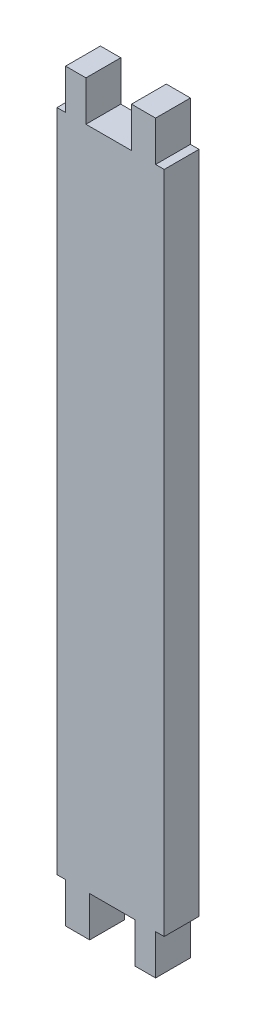
ISO-10303-21;
HEADER;
FILE_DESCRIPTION(('STEP AP214'),'2;1');
FILE_NAME('part.step','',(''),(''),'','','');
FILE_SCHEMA(('AUTOMOTIVE_DESIGN { 1 0 10303 214 1 1 1 1 }'));
ENDSEC;
DATA;
#1=APPLICATION_CONTEXT('core data for automotive mechanical design processes');
#2=APPLICATION_PROTOCOL_DEFINITION('international standard','automotive_design',2000,#1);
#3=PRODUCT_CONTEXT('',#1,'mechanical');
#4=PRODUCT('Part','Part','',(#3));
#5=PRODUCT_RELATED_PRODUCT_CATEGORY('part','',(#4));
#6=PRODUCT_DEFINITION_FORMATION('','',#4);
#7=PRODUCT_DEFINITION_CONTEXT('part definition',#1,'design');
#8=PRODUCT_DEFINITION('design','',#6,#7);
#9=PRODUCT_DEFINITION_SHAPE('','',#8);
#10=(LENGTH_UNIT() NAMED_UNIT(*) SI_UNIT(.MILLI.,.METRE.));
#11=(NAMED_UNIT(*) PLANE_ANGLE_UNIT() SI_UNIT($,.RADIAN.));
#12=(NAMED_UNIT(*) SI_UNIT($,.STERADIAN.) SOLID_ANGLE_UNIT());
#13=UNCERTAINTY_MEASURE_WITH_UNIT(LENGTH_MEASURE(1.E-05),#10,'distance_accuracy_value','');
#14=(GEOMETRIC_REPRESENTATION_CONTEXT(3) GLOBAL_UNCERTAINTY_ASSIGNED_CONTEXT((#13)) GLOBAL_UNIT_ASSIGNED_CONTEXT((#10,
#11,#12)) REPRESENTATION_CONTEXT('',''));
#15=CARTESIAN_POINT('',(0.,0.,0.));
#16=DIRECTION('',(0.,0.,1.));
#17=DIRECTION('',(1.,0.,0.));
#18=AXIS2_PLACEMENT_3D('',#15,#16,#17);
#19=CARTESIAN_POINT('',(-23.399,0.502,17.5001));
#20=DIRECTION('',(-1.,0.,0.));
#21=DIRECTION('',(0.,-1.,0.));
#22=AXIS2_PLACEMENT_3D('',#19,#20,#21);
#23=PLANE('',#22);
#24=DIRECTION('',(0.,1.,0.));
#25=VECTOR('',#24,1.);
#26=CARTESIAN_POINT('',(-23.399,-6.999,24.0001));
#27=LINE('',#26,#25);
#28=CARTESIAN_POINT('',(-23.399,-6.999,24.0001));
#29=VERTEX_POINT('',#28);
#30=CARTESIAN_POINT('',(-23.399,0.502,24.0001));
#31=VERTEX_POINT('',#30);
#32=EDGE_CURVE('E169',#29,#31,#27,.T.);
#33=ORIENTED_EDGE('',*,*,#32,.T.);
#34=DIRECTION('',(0.,0.,-1.));
#35=VECTOR('',#34,1.);
#36=CARTESIAN_POINT('',(-23.399,0.502,24.0001));
#37=LINE('',#36,#35);
#38=CARTESIAN_POINT('',(-23.399,0.502,17.5001));
#39=VERTEX_POINT('',#38);
#40=EDGE_CURVE('E158',#39,#31,#37,.F.);
#41=ORIENTED_EDGE('',*,*,#40,.F.);
#42=DIRECTION('',(0.,-1.,0.));
#43=VECTOR('',#42,1.);
#44=CARTESIAN_POINT('',(-23.399,0.502,17.5001));
#45=LINE('',#44,#43);
#46=CARTESIAN_POINT('',(-23.399,-6.999,17.5001));
#47=VERTEX_POINT('',#46);
#48=EDGE_CURVE('E168',#39,#47,#45,.T.);
#49=ORIENTED_EDGE('',*,*,#48,.T.);
#50=DIRECTION('',(0.,0.,1.));
#51=VECTOR('',#50,1.);
#52=CARTESIAN_POINT('',(-23.399,-6.999,17.5001));
#53=LINE('',#52,#51);
#54=EDGE_CURVE('E181',#47,#29,#53,.T.);
#55=ORIENTED_EDGE('',*,*,#54,.T.);
#56=EDGE_LOOP('',(#33,#41,#49,#55));
#57=FACE_BOUND('',#56,.T.);
#58=ADVANCED_FACE('F17',(#57),#23,.T.);
#59=CARTESIAN_POINT('',(-18.,-6.999,24.0001));
#60=DIRECTION('',(0.,0.,1.));
#61=DIRECTION('',(0.,1.,0.));
#62=AXIS2_PLACEMENT_3D('',#59,#60,#61);
#63=PLANE('',#62);
#64=ORIENTED_EDGE('',*,*,#32,.F.);
#65=DIRECTION('',(1.,0.,0.));
#66=VECTOR('',#65,1.);
#67=CARTESIAN_POINT('',(-23.399,-6.999,24.0001));
#68=LINE('',#67,#66);
#69=CARTESIAN_POINT('',(-19.601,-6.999,24.0001));
#70=VERTEX_POINT('',#69);
#71=EDGE_CURVE('E192',#70,#29,#68,.F.);
#72=ORIENTED_EDGE('',*,*,#71,.F.);
#73=DIRECTION('',(0.,1.,0.));
#74=VECTOR('',#73,1.);
#75=CARTESIAN_POINT('',(-19.601,-6.999,24.0001));
#76=LINE('',#75,#74);
#77=CARTESIAN_POINT('',(-19.601,0.502,24.0001));
#78=VERTEX_POINT('',#77);
#79=EDGE_CURVE('E196',#78,#70,#76,.F.);
#80=ORIENTED_EDGE('',*,*,#79,.F.);
#81=DIRECTION('',(1.,0.,0.));
#82=VECTOR('',#81,1.);
#83=CARTESIAN_POINT('',(-19.601,0.502,24.0001));
#84=LINE('',#83,#82);
#85=CARTESIAN_POINT('',(-18.,0.502,24.0001));
#86=VERTEX_POINT('',#85);
#87=EDGE_CURVE('E200',#86,#78,#84,.F.);
#88=ORIENTED_EDGE('',*,*,#87,.F.);
#89=DIRECTION('',(0.,1.,0.));
#90=VECTOR('',#89,1.);
#91=CARTESIAN_POINT('',(-18.,0.502,24.0001));
#92=LINE('',#91,#90);
#93=CARTESIAN_POINT('',(-18.,124.5,24.0001));
#94=VERTEX_POINT('',#93);
#95=EDGE_CURVE('E204',#94,#86,#92,.F.);
#96=ORIENTED_EDGE('',*,*,#95,.F.);
#97=DIRECTION('',(-1.,0.,0.));
#98=VECTOR('',#97,1.);
#99=CARTESIAN_POINT('',(-18.,124.5,24.0001));
#100=LINE('',#99,#98);
#101=CARTESIAN_POINT('',(-19.601,124.5,24.0001));
#102=VERTEX_POINT('',#101);
#103=EDGE_CURVE('E208',#102,#94,#100,.F.);
#104=ORIENTED_EDGE('',*,*,#103,.F.);
#105=DIRECTION('',(0.,1.,0.));
#106=VECTOR('',#105,1.);
#107=CARTESIAN_POINT('',(-19.601,124.5,24.0001));
#108=LINE('',#107,#106);
#109=CARTESIAN_POINT('',(-19.601,132.001,24.0001));
#110=VERTEX_POINT('',#109);
#111=EDGE_CURVE('E212',#110,#102,#108,.F.);
#112=ORIENTED_EDGE('',*,*,#111,.F.);
#113=DIRECTION('',(-1.,0.,0.));
#114=VECTOR('',#113,1.);
#115=CARTESIAN_POINT('',(-19.601,132.001,24.0001));
#116=LINE('',#115,#114);
#117=CARTESIAN_POINT('',(-24.099,132.001,24.0001));
#118=VERTEX_POINT('',#117);
#119=EDGE_CURVE('E216',#118,#110,#116,.F.);
#120=ORIENTED_EDGE('',*,*,#119,.F.);
#121=DIRECTION('',(0.,-1.,0.));
#122=VECTOR('',#121,1.);
#123=CARTESIAN_POINT('',(-24.099,132.001,24.0001));
#124=LINE('',#123,#122);
#125=CARTESIAN_POINT('',(-24.099,124.5,24.0001));
#126=VERTEX_POINT('',#125);
#127=EDGE_CURVE('E220',#126,#118,#124,.F.);
#128=ORIENTED_EDGE('',*,*,#127,.F.);
#129=DIRECTION('',(-1.,0.,0.));
#130=VECTOR('',#129,1.);
#131=CARTESIAN_POINT('',(-24.099,124.5,24.0001));
#132=LINE('',#131,#130);
#133=CARTESIAN_POINT('',(-32.601,124.5,24.0001));
#134=VERTEX_POINT('',#133);
#135=EDGE_CURVE('E224',#134,#126,#132,.F.);
#136=ORIENTED_EDGE('',*,*,#135,.F.);
#137=DIRECTION('',(0.,1.,0.));
#138=VECTOR('',#137,1.);
#139=CARTESIAN_POINT('',(-32.601,124.5,24.0001));
#140=LINE('',#139,#138);
#141=CARTESIAN_POINT('',(-32.601,132.001,24.0001));
#142=VERTEX_POINT('',#141);
#143=EDGE_CURVE('E228',#142,#134,#140,.F.);
#144=ORIENTED_EDGE('',*,*,#143,.F.);
#145=DIRECTION('',(-1.,0.,0.));
#146=VECTOR('',#145,1.);
#147=CARTESIAN_POINT('',(-32.601,132.001,24.0001));
#148=LINE('',#147,#146);
#149=CARTESIAN_POINT('',(-36.399,132.001,24.0001));
#150=VERTEX_POINT('',#149);
#151=EDGE_CURVE('E232',#150,#142,#148,.F.);
#152=ORIENTED_EDGE('',*,*,#151,.F.);
#153=DIRECTION('',(0.,-1.,0.));
#154=VECTOR('',#153,1.);
#155=CARTESIAN_POINT('',(-36.399,132.001,24.0001));
#156=LINE('',#155,#154);
#157=CARTESIAN_POINT('',(-36.399,124.5,24.0001));
#158=VERTEX_POINT('',#157);
#159=EDGE_CURVE('E236',#158,#150,#156,.F.);
#160=ORIENTED_EDGE('',*,*,#159,.F.);
#161=DIRECTION('',(-1.,0.,0.));
#162=VECTOR('',#161,1.);
#163=CARTESIAN_POINT('',(-36.399,124.5,24.0001));
#164=LINE('',#163,#162);
#165=CARTESIAN_POINT('',(-38.,124.5,24.0001));
#166=VERTEX_POINT('',#165);
#167=EDGE_CURVE('E240',#166,#158,#164,.F.);
#168=ORIENTED_EDGE('',*,*,#167,.F.);
#169=DIRECTION('',(0.,-1.,0.));
#170=VECTOR('',#169,1.);
#171=CARTESIAN_POINT('',(-38.,124.5,24.0001));
#172=LINE('',#171,#170);
#173=CARTESIAN_POINT('',(-38.,0.502,24.0001));
#174=VERTEX_POINT('',#173);
#175=EDGE_CURVE('E244',#174,#166,#172,.F.);
#176=ORIENTED_EDGE('',*,*,#175,.F.);
#177=DIRECTION('',(1.,0.,0.));
#178=VECTOR('',#177,1.);
#179=CARTESIAN_POINT('',(-38.,0.502,24.0001));
#180=LINE('',#179,#178);
#181=CARTESIAN_POINT('',(-36.399,0.502,24.0001));
#182=VERTEX_POINT('',#181);
#183=EDGE_CURVE('E248',#182,#174,#180,.F.);
#184=ORIENTED_EDGE('',*,*,#183,.F.);
#185=DIRECTION('',(0.,-1.,0.));
#186=VECTOR('',#185,1.);
#187=CARTESIAN_POINT('',(-36.399,0.502,24.0001));
#188=LINE('',#187,#186);
#189=CARTESIAN_POINT('',(-36.399,-6.999,24.0001));
#190=VERTEX_POINT('',#189);
#191=EDGE_CURVE('E252',#190,#182,#188,.F.);
#192=ORIENTED_EDGE('',*,*,#191,.F.);
#193=DIRECTION('',(1.,0.,0.));
#194=VECTOR('',#193,1.);
#195=CARTESIAN_POINT('',(-36.399,-6.999,24.0001));
#196=LINE('',#195,#194);
#197=CARTESIAN_POINT('',(-31.901,-6.999,24.0001));
#198=VERTEX_POINT('',#197);
#199=EDGE_CURVE('E256',#198,#190,#196,.F.);
#200=ORIENTED_EDGE('',*,*,#199,.F.);
#201=DIRECTION('',(0.,1.,0.));
#202=VECTOR('',#201,1.);
#203=CARTESIAN_POINT('',(-31.901,-6.999,24.0001));
#204=LINE('',#203,#202);
#205=CARTESIAN_POINT('',(-31.901,0.502,24.0001));
#206=VERTEX_POINT('',#205);
#207=EDGE_CURVE('E177',#206,#198,#204,.F.);
#208=ORIENTED_EDGE('',*,*,#207,.F.);
#209=DIRECTION('',(1.,0.,0.));
#210=VECTOR('',#209,1.);
#211=CARTESIAN_POINT('',(-31.901,0.502,24.0001));
#212=LINE('',#211,#210);
#213=EDGE_CURVE('E162',#31,#206,#212,.F.);
#214=ORIENTED_EDGE('',*,*,#213,.F.);
#215=EDGE_LOOP('',(#64,#72,#80,#88,#96,#104,#112,#120,#128,#136,#144,#152,#160,#168,#176,#184,
#192,#200,#208,#214));
#216=FACE_BOUND('',#215,.T.);
#217=ADVANCED_FACE('F174',(#216),#63,.T.);
#218=CARTESIAN_POINT('',(-31.901,0.502,17.5001));
#219=DIRECTION('',(0.,-1.,0.));
#220=DIRECTION('',(1.,0.,0.));
#221=AXIS2_PLACEMENT_3D('',#218,#219,#220);
#222=PLANE('',#221);
#223=ORIENTED_EDGE('',*,*,#213,.T.);
#224=DIRECTION('',(0.,0.,-1.));
#225=VECTOR('',#224,1.);
#226=CARTESIAN_POINT('',(-31.901,0.502,24.0001));
#227=LINE('',#226,#225);
#228=CARTESIAN_POINT('',(-31.901,0.502,17.5001));
#229=VERTEX_POINT('',#228);
#230=EDGE_CURVE('E178',#229,#206,#227,.F.);
#231=ORIENTED_EDGE('',*,*,#230,.F.);
#232=DIRECTION('',(1.,0.,0.));
#233=VECTOR('',#232,1.);
#234=CARTESIAN_POINT('',(-31.901,0.502,17.5001));
#235=LINE('',#234,#233);
#236=EDGE_CURVE('E164',#229,#39,#235,.T.);
#237=ORIENTED_EDGE('',*,*,#236,.T.);
#238=ORIENTED_EDGE('',*,*,#40,.T.);
#239=EDGE_LOOP('',(#223,#231,#237,#238));
#240=FACE_BOUND('',#239,.T.);
#241=ADVANCED_FACE('F160',(#240),#222,.T.);
#242=CARTESIAN_POINT('',(-18.,-6.999,17.5001));
#243=DIRECTION('',(0.,0.,-1.));
#244=DIRECTION('',(-1.,0.,0.));
#245=AXIS2_PLACEMENT_3D('',#242,#243,#244);
#246=PLANE('',#245);
#247=DIRECTION('',(-1.,0.,0.));
#248=VECTOR('',#247,1.);
#249=CARTESIAN_POINT('',(-19.601,-6.999,17.5001));
#250=LINE('',#249,#248);
#251=CARTESIAN_POINT('',(-19.601,-6.999,17.5001));
#252=VERTEX_POINT('',#251);
#253=EDGE_CURVE('E271',#47,#252,#250,.F.);
#254=ORIENTED_EDGE('',*,*,#253,.F.);
#255=ORIENTED_EDGE('',*,*,#48,.F.);
#256=ORIENTED_EDGE('',*,*,#236,.F.);
#257=DIRECTION('',(0.,-1.,0.));
#258=VECTOR('',#257,1.);
#259=CARTESIAN_POINT('',(-31.901,0.502,17.5001));
#260=LINE('',#259,#258);
#261=CARTESIAN_POINT('',(-31.901,-6.999,17.5001));
#262=VERTEX_POINT('',#261);
#263=EDGE_CURVE('E276',#262,#229,#260,.F.);
#264=ORIENTED_EDGE('',*,*,#263,.F.);
#265=DIRECTION('',(-1.,0.,0.));
#266=VECTOR('',#265,1.);
#267=CARTESIAN_POINT('',(-31.901,-6.999,17.5001));
#268=LINE('',#267,#266);
#269=CARTESIAN_POINT('',(-36.399,-6.999,17.5001));
#270=VERTEX_POINT('',#269);
#271=EDGE_CURVE('E280',#270,#262,#268,.F.);
#272=ORIENTED_EDGE('',*,*,#271,.F.);
#273=DIRECTION('',(0.,1.,0.));
#274=VECTOR('',#273,1.);
#275=CARTESIAN_POINT('',(-36.399,-6.999,17.5001));
#276=LINE('',#275,#274);
#277=CARTESIAN_POINT('',(-36.399,0.502,17.5001));
#278=VERTEX_POINT('',#277);
#279=EDGE_CURVE('E285',#278,#270,#276,.F.);
#280=ORIENTED_EDGE('',*,*,#279,.F.);
#281=DIRECTION('',(-1.,0.,0.));
#282=VECTOR('',#281,1.);
#283=CARTESIAN_POINT('',(-36.399,0.502,17.5001));
#284=LINE('',#283,#282);
#285=CARTESIAN_POINT('',(-38.,0.502,17.5001));
#286=VERTEX_POINT('',#285);
#287=EDGE_CURVE('E290',#286,#278,#284,.F.);
#288=ORIENTED_EDGE('',*,*,#287,.F.);
#289=DIRECTION('',(0.,1.,0.));
#290=VECTOR('',#289,1.);
#291=CARTESIAN_POINT('',(-38.,0.502,17.5001));
#292=LINE('',#291,#290);
#293=CARTESIAN_POINT('',(-38.,124.5,17.5001));
#294=VERTEX_POINT('',#293);
#295=EDGE_CURVE('E295',#294,#286,#292,.F.);
#296=ORIENTED_EDGE('',*,*,#295,.F.);
#297=DIRECTION('',(1.,0.,0.));
#298=VECTOR('',#297,1.);
#299=CARTESIAN_POINT('',(-38.,124.5,17.5001));
#300=LINE('',#299,#298);
#301=CARTESIAN_POINT('',(-36.399,124.5,17.5001));
#302=VERTEX_POINT('',#301);
#303=EDGE_CURVE('E300',#302,#294,#300,.F.);
#304=ORIENTED_EDGE('',*,*,#303,.F.);
#305=DIRECTION('',(0.,1.,0.));
#306=VECTOR('',#305,1.);
#307=CARTESIAN_POINT('',(-36.399,124.5,17.5001));
#308=LINE('',#307,#306);
#309=CARTESIAN_POINT('',(-36.399,132.001,17.5001));
#310=VERTEX_POINT('',#309);
#311=EDGE_CURVE('E305',#310,#302,#308,.F.);
#312=ORIENTED_EDGE('',*,*,#311,.F.);
#313=DIRECTION('',(1.,0.,0.));
#314=VECTOR('',#313,1.);
#315=CARTESIAN_POINT('',(-36.399,132.001,17.5001));
#316=LINE('',#315,#314);
#317=CARTESIAN_POINT('',(-32.601,132.001,17.5001));
#318=VERTEX_POINT('',#317);
#319=EDGE_CURVE('E310',#318,#310,#316,.F.);
#320=ORIENTED_EDGE('',*,*,#319,.F.);
#321=DIRECTION('',(0.,-1.,0.));
#322=VECTOR('',#321,1.);
#323=CARTESIAN_POINT('',(-32.601,132.001,17.5001));
#324=LINE('',#323,#322);
#325=CARTESIAN_POINT('',(-32.601,124.5,17.5001));
#326=VERTEX_POINT('',#325);
#327=EDGE_CURVE('E315',#326,#318,#324,.F.);
#328=ORIENTED_EDGE('',*,*,#327,.F.);
#329=DIRECTION('',(1.,0.,0.));
#330=VECTOR('',#329,1.);
#331=CARTESIAN_POINT('',(-32.601,124.5,17.5001));
#332=LINE('',#331,#330);
#333=CARTESIAN_POINT('',(-24.099,124.5,17.5001));
#334=VERTEX_POINT('',#333);
#335=EDGE_CURVE('E320',#334,#326,#332,.F.);
#336=ORIENTED_EDGE('',*,*,#335,.F.);
#337=DIRECTION('',(0.,1.,0.));
#338=VECTOR('',#337,1.);
#339=CARTESIAN_POINT('',(-24.099,124.5,17.5001));
#340=LINE('',#339,#338);
#341=CARTESIAN_POINT('',(-24.099,132.001,17.5001));
#342=VERTEX_POINT('',#341);
#343=EDGE_CURVE('E325',#342,#334,#340,.F.);
#344=ORIENTED_EDGE('',*,*,#343,.F.);
#345=DIRECTION('',(1.,0.,0.));
#346=VECTOR('',#345,1.);
#347=CARTESIAN_POINT('',(-24.099,132.001,17.5001));
#348=LINE('',#347,#346);
#349=CARTESIAN_POINT('',(-19.601,132.001,17.5001));
#350=VERTEX_POINT('',#349);
#351=EDGE_CURVE('E330',#350,#342,#348,.F.);
#352=ORIENTED_EDGE('',*,*,#351,.F.);
#353=DIRECTION('',(0.,-1.,0.));
#354=VECTOR('',#353,1.);
#355=CARTESIAN_POINT('',(-19.601,132.001,17.5001));
#356=LINE('',#355,#354);
#357=CARTESIAN_POINT('',(-19.601,124.5,17.5001));
#358=VERTEX_POINT('',#357);
#359=EDGE_CURVE('E335',#358,#350,#356,.F.);
#360=ORIENTED_EDGE('',*,*,#359,.F.);
#361=DIRECTION('',(1.,0.,0.));
#362=VECTOR('',#361,1.);
#363=CARTESIAN_POINT('',(-19.601,124.5,17.5001));
#364=LINE('',#363,#362);
#365=CARTESIAN_POINT('',(-18.,124.5,17.5001));
#366=VERTEX_POINT('',#365);
#367=EDGE_CURVE('E340',#366,#358,#364,.F.);
#368=ORIENTED_EDGE('',*,*,#367,.F.);
#369=DIRECTION('',(0.,-1.,0.));
#370=VECTOR('',#369,1.);
#371=CARTESIAN_POINT('',(-18.,124.5,17.5001));
#372=LINE('',#371,#370);
#373=CARTESIAN_POINT('',(-18.,0.502,17.5001));
#374=VERTEX_POINT('',#373);
#375=EDGE_CURVE('E345',#374,#366,#372,.F.);
#376=ORIENTED_EDGE('',*,*,#375,.F.);
#377=DIRECTION('',(-1.,0.,0.));
#378=VECTOR('',#377,1.);
#379=CARTESIAN_POINT('',(-18.,0.502,17.5001));
#380=LINE('',#379,#378);
#381=CARTESIAN_POINT('',(-19.601,0.502,17.5001));
#382=VERTEX_POINT('',#381);
#383=EDGE_CURVE('E350',#382,#374,#380,.F.);
#384=ORIENTED_EDGE('',*,*,#383,.F.);
#385=DIRECTION('',(0.,-1.,0.));
#386=VECTOR('',#385,1.);
#387=CARTESIAN_POINT('',(-19.601,0.502,17.5001));
#388=LINE('',#387,#386);
#389=EDGE_CURVE('E354',#252,#382,#388,.F.);
#390=ORIENTED_EDGE('',*,*,#389,.F.);
#391=EDGE_LOOP('',(#254,#255,#256,#264,#272,#280,#288,#296,#304,#312,#320,#328,#336,#344,#352,
#360,#368,#376,#384,#390));
#392=FACE_BOUND('',#391,.T.);
#393=ADVANCED_FACE('F452',(#392),#246,.T.);
#394=CARTESIAN_POINT('',(-23.399,-6.999,17.5001));
#395=DIRECTION('',(0.,-1.,0.));
#396=DIRECTION('',(1.,0.,0.));
#397=AXIS2_PLACEMENT_3D('',#394,#395,#396);
#398=PLANE('',#397);
#399=ORIENTED_EDGE('',*,*,#71,.T.);
#400=ORIENTED_EDGE('',*,*,#54,.F.);
#401=ORIENTED_EDGE('',*,*,#253,.T.);
#402=DIRECTION('',(0.,0.,1.));
#403=VECTOR('',#402,1.);
#404=CARTESIAN_POINT('',(-19.601,-6.999,17.5001));
#405=LINE('',#404,#403);
#406=EDGE_CURVE('E33',#252,#70,#405,.T.);
#407=ORIENTED_EDGE('',*,*,#406,.T.);
#408=EDGE_LOOP('',(#399,#400,#401,#407));
#409=FACE_BOUND('',#408,.T.);
#410=ADVANCED_FACE('F496',(#409),#398,.T.);
#411=CARTESIAN_POINT('',(-19.601,-6.999,17.5001));
#412=DIRECTION('',(1.,0.,0.));
#413=DIRECTION('',(0.,1.,0.));
#414=AXIS2_PLACEMENT_3D('',#411,#412,#413);
#415=PLANE('',#414);
#416=ORIENTED_EDGE('',*,*,#79,.T.);
#417=ORIENTED_EDGE('',*,*,#406,.F.);
#418=ORIENTED_EDGE('',*,*,#389,.T.);
#419=DIRECTION('',(0.,0.,1.));
#420=VECTOR('',#419,1.);
#421=CARTESIAN_POINT('',(-19.601,0.502,17.5001));
#422=LINE('',#421,#420);
#423=EDGE_CURVE('E41',#382,#78,#422,.T.);
#424=ORIENTED_EDGE('',*,*,#423,.T.);
#425=EDGE_LOOP('',(#416,#417,#418,#424));
#426=FACE_BOUND('',#425,.T.);
#427=ADVANCED_FACE('F494',(#426),#415,.T.);
#428=CARTESIAN_POINT('',(-19.601,0.502,17.5001));
#429=DIRECTION('',(0.,-1.,0.));
#430=DIRECTION('',(1.,0.,0.));
#431=AXIS2_PLACEMENT_3D('',#428,#429,#430);
#432=PLANE('',#431);
#433=ORIENTED_EDGE('',*,*,#87,.T.);
#434=ORIENTED_EDGE('',*,*,#423,.F.);
#435=ORIENTED_EDGE('',*,*,#383,.T.);
#436=DIRECTION('',(0.,0.,1.));
#437=VECTOR('',#436,1.);
#438=CARTESIAN_POINT('',(-18.,0.502,17.5001));
#439=LINE('',#438,#437);
#440=EDGE_CURVE('E364',#374,#86,#439,.T.);
#441=ORIENTED_EDGE('',*,*,#440,.T.);
#442=EDGE_LOOP('',(#433,#434,#435,#441));
#443=FACE_BOUND('',#442,.T.);
#444=ADVANCED_FACE('F493',(#443),#432,.T.);
#445=CARTESIAN_POINT('',(-18.,0.502,17.5001));
#446=DIRECTION('',(1.,0.,0.));
#447=DIRECTION('',(0.,1.,0.));
#448=AXIS2_PLACEMENT_3D('',#445,#446,#447);
#449=PLANE('',#448);
#450=ORIENTED_EDGE('',*,*,#95,.T.);
#451=ORIENTED_EDGE('',*,*,#440,.F.);
#452=ORIENTED_EDGE('',*,*,#375,.T.);
#453=DIRECTION('',(0.,0.,1.));
#454=VECTOR('',#453,1.);
#455=CARTESIAN_POINT('',(-18.,124.5,17.5001));
#456=LINE('',#455,#454);
#457=EDGE_CURVE('E369',#366,#94,#456,.T.);
#458=ORIENTED_EDGE('',*,*,#457,.T.);
#459=EDGE_LOOP('',(#450,#451,#452,#458));
#460=FACE_BOUND('',#459,.T.);
#461=ADVANCED_FACE('F490',(#460),#449,.T.);
#462=CARTESIAN_POINT('',(-18.,124.5,17.5001));
#463=DIRECTION('',(0.,1.,0.));
#464=DIRECTION('',(-1.,0.,0.));
#465=AXIS2_PLACEMENT_3D('',#462,#463,#464);
#466=PLANE('',#465);
#467=ORIENTED_EDGE('',*,*,#103,.T.);
#468=ORIENTED_EDGE('',*,*,#457,.F.);
#469=ORIENTED_EDGE('',*,*,#367,.T.);
#470=DIRECTION('',(0.,0.,1.));
#471=VECTOR('',#470,1.);
#472=CARTESIAN_POINT('',(-19.601,124.5,17.5001));
#473=LINE('',#472,#471);
#474=EDGE_CURVE('E374',#358,#102,#473,.T.);
#475=ORIENTED_EDGE('',*,*,#474,.T.);
#476=EDGE_LOOP('',(#467,#468,#469,#475));
#477=FACE_BOUND('',#476,.T.);
#478=ADVANCED_FACE('F487',(#477),#466,.T.);
#479=CARTESIAN_POINT('',(-19.601,124.5,17.5001));
#480=DIRECTION('',(1.,0.,0.));
#481=DIRECTION('',(0.,1.,0.));
#482=AXIS2_PLACEMENT_3D('',#479,#480,#481);
#483=PLANE('',#482);
#484=ORIENTED_EDGE('',*,*,#111,.T.);
#485=ORIENTED_EDGE('',*,*,#474,.F.);
#486=ORIENTED_EDGE('',*,*,#359,.T.);
#487=DIRECTION('',(0.,0.,1.));
#488=VECTOR('',#487,1.);
#489=CARTESIAN_POINT('',(-19.601,132.001,17.5001));
#490=LINE('',#489,#488);
#491=EDGE_CURVE('E379',#350,#110,#490,.T.);
#492=ORIENTED_EDGE('',*,*,#491,.T.);
#493=EDGE_LOOP('',(#484,#485,#486,#492));
#494=FACE_BOUND('',#493,.T.);
#495=ADVANCED_FACE('F482',(#494),#483,.T.);
#496=CARTESIAN_POINT('',(-19.601,132.001,17.5001));
#497=DIRECTION('',(0.,1.,0.));
#498=DIRECTION('',(-1.,0.,0.));
#499=AXIS2_PLACEMENT_3D('',#496,#497,#498);
#500=PLANE('',#499);
#501=ORIENTED_EDGE('',*,*,#119,.T.);
#502=ORIENTED_EDGE('',*,*,#491,.F.);
#503=ORIENTED_EDGE('',*,*,#351,.T.);
#504=DIRECTION('',(0.,0.,1.));
#505=VECTOR('',#504,1.);
#506=CARTESIAN_POINT('',(-24.099,132.001,17.5001));
#507=LINE('',#506,#505);
#508=EDGE_CURVE('E384',#342,#118,#507,.T.);
#509=ORIENTED_EDGE('',*,*,#508,.T.);
#510=EDGE_LOOP('',(#501,#502,#503,#509));
#511=FACE_BOUND('',#510,.T.);
#512=ADVANCED_FACE('F479',(#511),#500,.T.);
#513=CARTESIAN_POINT('',(-24.099,132.001,17.5001));
#514=DIRECTION('',(-1.,0.,0.));
#515=DIRECTION('',(0.,-1.,0.));
#516=AXIS2_PLACEMENT_3D('',#513,#514,#515);
#517=PLANE('',#516);
#518=ORIENTED_EDGE('',*,*,#127,.T.);
#519=ORIENTED_EDGE('',*,*,#508,.F.);
#520=ORIENTED_EDGE('',*,*,#343,.T.);
#521=DIRECTION('',(0.,0.,1.));
#522=VECTOR('',#521,1.);
#523=CARTESIAN_POINT('',(-24.099,124.5,17.5001));
#524=LINE('',#523,#522);
#525=EDGE_CURVE('E389',#334,#126,#524,.T.);
#526=ORIENTED_EDGE('',*,*,#525,.T.);
#527=EDGE_LOOP('',(#518,#519,#520,#526));
#528=FACE_BOUND('',#527,.T.);
#529=ADVANCED_FACE('F474',(#528),#517,.T.);
#530=CARTESIAN_POINT('',(-24.099,124.5,17.5001));
#531=DIRECTION('',(0.,1.,0.));
#532=DIRECTION('',(-1.,0.,0.));
#533=AXIS2_PLACEMENT_3D('',#530,#531,#532);
#534=PLANE('',#533);
#535=ORIENTED_EDGE('',*,*,#135,.T.);
#536=ORIENTED_EDGE('',*,*,#525,.F.);
#537=ORIENTED_EDGE('',*,*,#335,.T.);
#538=DIRECTION('',(0.,0.,1.));
#539=VECTOR('',#538,1.);
#540=CARTESIAN_POINT('',(-32.601,124.5,17.5001));
#541=LINE('',#540,#539);
#542=EDGE_CURVE('E394',#326,#134,#541,.T.);
#543=ORIENTED_EDGE('',*,*,#542,.T.);
#544=EDGE_LOOP('',(#535,#536,#537,#543));
#545=FACE_BOUND('',#544,.T.);
#546=ADVANCED_FACE('F471',(#545),#534,.T.);
#547=CARTESIAN_POINT('',(-32.601,124.5,17.5001));
#548=DIRECTION('',(1.,0.,0.));
#549=DIRECTION('',(0.,1.,0.));
#550=AXIS2_PLACEMENT_3D('',#547,#548,#549);
#551=PLANE('',#550);
#552=ORIENTED_EDGE('',*,*,#143,.T.);
#553=ORIENTED_EDGE('',*,*,#542,.F.);
#554=ORIENTED_EDGE('',*,*,#327,.T.);
#555=DIRECTION('',(0.,0.,1.));
#556=VECTOR('',#555,1.);
#557=CARTESIAN_POINT('',(-32.601,132.001,17.5001));
#558=LINE('',#557,#556);
#559=EDGE_CURVE('E399',#318,#142,#558,.T.);
#560=ORIENTED_EDGE('',*,*,#559,.T.);
#561=EDGE_LOOP('',(#552,#553,#554,#560));
#562=FACE_BOUND('',#561,.T.);
#563=ADVANCED_FACE('F466',(#562),#551,.T.);
#564=CARTESIAN_POINT('',(-32.601,132.001,17.5001));
#565=DIRECTION('',(0.,1.,0.));
#566=DIRECTION('',(-1.,0.,0.));
#567=AXIS2_PLACEMENT_3D('',#564,#565,#566);
#568=PLANE('',#567);
#569=ORIENTED_EDGE('',*,*,#151,.T.);
#570=ORIENTED_EDGE('',*,*,#559,.F.);
#571=ORIENTED_EDGE('',*,*,#319,.T.);
#572=DIRECTION('',(0.,0.,1.));
#573=VECTOR('',#572,1.);
#574=CARTESIAN_POINT('',(-36.399,132.001,17.5001));
#575=LINE('',#574,#573);
#576=EDGE_CURVE('E404',#310,#150,#575,.T.);
#577=ORIENTED_EDGE('',*,*,#576,.T.);
#578=EDGE_LOOP('',(#569,#570,#571,#577));
#579=FACE_BOUND('',#578,.T.);
#580=ADVANCED_FACE('F463',(#579),#568,.T.);
#581=CARTESIAN_POINT('',(-36.399,132.001,17.5001));
#582=DIRECTION('',(-1.,0.,0.));
#583=DIRECTION('',(0.,-1.,0.));
#584=AXIS2_PLACEMENT_3D('',#581,#582,#583);
#585=PLANE('',#584);
#586=ORIENTED_EDGE('',*,*,#159,.T.);
#587=ORIENTED_EDGE('',*,*,#576,.F.);
#588=ORIENTED_EDGE('',*,*,#311,.T.);
#589=DIRECTION('',(0.,0.,1.));
#590=VECTOR('',#589,1.);
#591=CARTESIAN_POINT('',(-36.399,124.5,17.5001));
#592=LINE('',#591,#590);
#593=EDGE_CURVE('E409',#302,#158,#592,.T.);
#594=ORIENTED_EDGE('',*,*,#593,.T.);
#595=EDGE_LOOP('',(#586,#587,#588,#594));
#596=FACE_BOUND('',#595,.T.);
#597=ADVANCED_FACE('F458',(#596),#585,.T.);
#598=CARTESIAN_POINT('',(-36.399,124.5,17.5001));
#599=DIRECTION('',(0.,1.,0.));
#600=DIRECTION('',(-1.,0.,0.));
#601=AXIS2_PLACEMENT_3D('',#598,#599,#600);
#602=PLANE('',#601);
#603=ORIENTED_EDGE('',*,*,#167,.T.);
#604=ORIENTED_EDGE('',*,*,#593,.F.);
#605=ORIENTED_EDGE('',*,*,#303,.T.);
#606=DIRECTION('',(0.,0.,1.));
#607=VECTOR('',#606,1.);
#608=CARTESIAN_POINT('',(-38.,124.5,17.5001));
#609=LINE('',#608,#607);
#610=EDGE_CURVE('E414',#294,#166,#609,.T.);
#611=ORIENTED_EDGE('',*,*,#610,.T.);
#612=EDGE_LOOP('',(#603,#604,#605,#611));
#613=FACE_BOUND('',#612,.T.);
#614=ADVANCED_FACE('F455',(#613),#602,.T.);
#615=CARTESIAN_POINT('',(-38.,124.5,17.5001));
#616=DIRECTION('',(-1.,0.,0.));
#617=DIRECTION('',(0.,-1.,0.));
#618=AXIS2_PLACEMENT_3D('',#615,#616,#617);
#619=PLANE('',#618);
#620=ORIENTED_EDGE('',*,*,#175,.T.);
#621=ORIENTED_EDGE('',*,*,#610,.F.);
#622=ORIENTED_EDGE('',*,*,#295,.T.);
#623=DIRECTION('',(0.,0.,1.));
#624=VECTOR('',#623,1.);
#625=CARTESIAN_POINT('',(-38.,0.502,17.5001));
#626=LINE('',#625,#624);
#627=EDGE_CURVE('E419',#286,#174,#626,.T.);
#628=ORIENTED_EDGE('',*,*,#627,.T.);
#629=EDGE_LOOP('',(#620,#621,#622,#628));
#630=FACE_BOUND('',#629,.T.);
#631=ADVANCED_FACE('F447',(#630),#619,.T.);
#632=CARTESIAN_POINT('',(-38.,0.502,17.5001));
#633=DIRECTION('',(0.,-1.,0.));
#634=DIRECTION('',(1.,0.,0.));
#635=AXIS2_PLACEMENT_3D('',#632,#633,#634);
#636=PLANE('',#635);
#637=ORIENTED_EDGE('',*,*,#183,.T.);
#638=ORIENTED_EDGE('',*,*,#627,.F.);
#639=ORIENTED_EDGE('',*,*,#287,.T.);
#640=DIRECTION('',(0.,0.,1.));
#641=VECTOR('',#640,1.);
#642=CARTESIAN_POINT('',(-36.399,0.502,17.5001));
#643=LINE('',#642,#641);
#644=EDGE_CURVE('E424',#278,#182,#643,.T.);
#645=ORIENTED_EDGE('',*,*,#644,.T.);
#646=EDGE_LOOP('',(#637,#638,#639,#645));
#647=FACE_BOUND('',#646,.T.);
#648=ADVANCED_FACE('F444',(#647),#636,.T.);
#649=CARTESIAN_POINT('',(-36.399,0.502,17.5001));
#650=DIRECTION('',(-1.,0.,0.));
#651=DIRECTION('',(0.,-1.,0.));
#652=AXIS2_PLACEMENT_3D('',#649,#650,#651);
#653=PLANE('',#652);
#654=ORIENTED_EDGE('',*,*,#191,.T.);
#655=ORIENTED_EDGE('',*,*,#644,.F.);
#656=ORIENTED_EDGE('',*,*,#279,.T.);
#657=DIRECTION('',(0.,0.,1.));
#658=VECTOR('',#657,1.);
#659=CARTESIAN_POINT('',(-36.399,-6.999,17.5001));
#660=LINE('',#659,#658);
#661=EDGE_CURVE('E26',#270,#190,#660,.T.);
#662=ORIENTED_EDGE('',*,*,#661,.T.);
#663=EDGE_LOOP('',(#654,#655,#656,#662));
#664=FACE_BOUND('',#663,.T.);
#665=ADVANCED_FACE('F436',(#664),#653,.T.);
#666=CARTESIAN_POINT('',(-36.399,-6.999,17.5001));
#667=DIRECTION('',(0.,-1.,0.));
#668=DIRECTION('',(1.,0.,0.));
#669=AXIS2_PLACEMENT_3D('',#666,#667,#668);
#670=PLANE('',#669);
#671=ORIENTED_EDGE('',*,*,#199,.T.);
#672=ORIENTED_EDGE('',*,*,#661,.F.);
#673=ORIENTED_EDGE('',*,*,#271,.T.);
#674=DIRECTION('',(0.,0.,1.));
#675=VECTOR('',#674,1.);
#676=CARTESIAN_POINT('',(-31.901,-6.999,17.5001));
#677=LINE('',#676,#675);
#678=EDGE_CURVE('E11',#262,#198,#677,.T.);
#679=ORIENTED_EDGE('',*,*,#678,.T.);
#680=EDGE_LOOP('',(#671,#672,#673,#679));
#681=FACE_BOUND('',#680,.T.);
#682=ADVANCED_FACE('F669',(#681),#670,.T.);
#683=CARTESIAN_POINT('',(-31.901,-6.999,17.5001));
#684=DIRECTION('',(1.,0.,0.));
#685=DIRECTION('',(0.,1.,0.));
#686=AXIS2_PLACEMENT_3D('',#683,#684,#685);
#687=PLANE('',#686);
#688=ORIENTED_EDGE('',*,*,#207,.T.);
#689=ORIENTED_EDGE('',*,*,#678,.F.);
#690=ORIENTED_EDGE('',*,*,#263,.T.);
#691=ORIENTED_EDGE('',*,*,#230,.T.);
#692=EDGE_LOOP('',(#688,#689,#690,#691));
#693=FACE_BOUND('',#692,.T.);
#694=ADVANCED_FACE('F19',(#693),#687,.T.);
#695=CLOSED_SHELL('',(#58,#217,#241,#393,#410,#427,#444,#461,#478,#495,#512,#529,#546,#563,#580,
#597,#614,#631,#648,#665,#682,#694));
#696=MANIFOLD_SOLID_BREP('B1',#695);
#697=ADVANCED_BREP_SHAPE_REPRESENTATION('',(#18,#696),#14);
#698=SHAPE_DEFINITION_REPRESENTATION(#9,#697);
ENDSEC;
END-ISO-10303-21;
